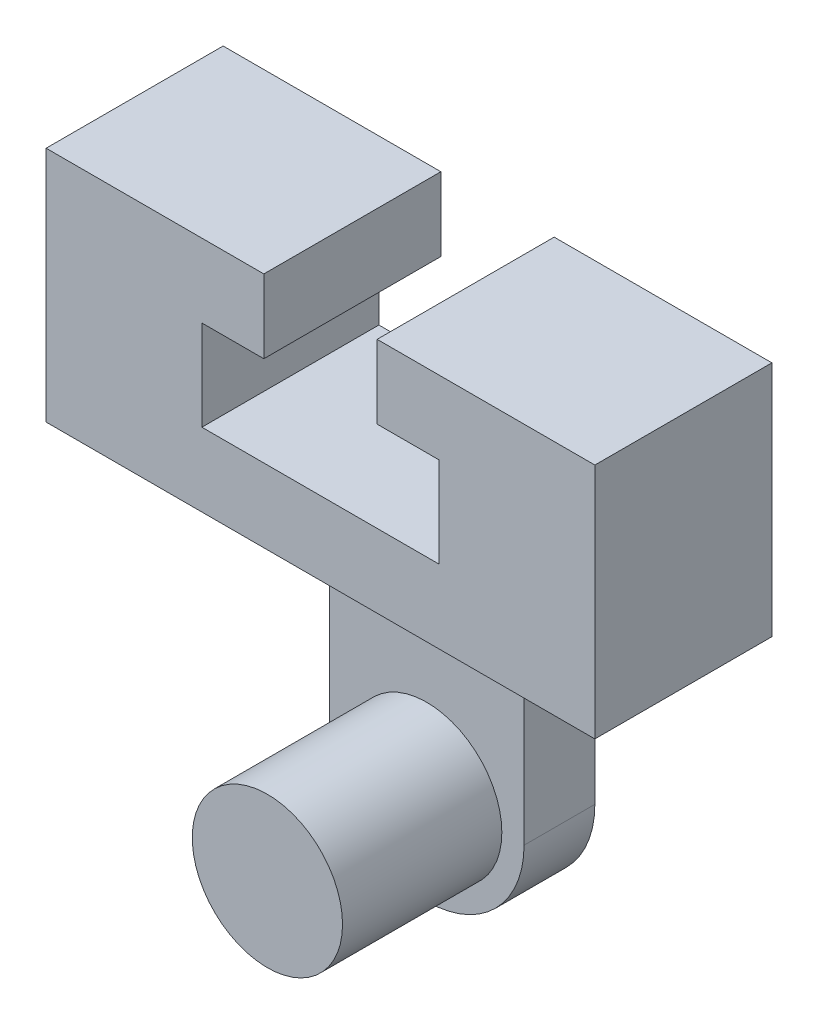
ISO-10303-21;
HEADER;
FILE_DESCRIPTION(('STEP AP214'),'2;1');
FILE_NAME('part.step','',(''),(''),'','','');
FILE_SCHEMA(('AUTOMOTIVE_DESIGN { 1 0 10303 214 1 1 1 1 }'));
ENDSEC;
DATA;
#1=APPLICATION_CONTEXT('core data for automotive mechanical design processes');
#2=APPLICATION_PROTOCOL_DEFINITION('international standard','automotive_design',2000,#1);
#3=PRODUCT_CONTEXT('',#1,'mechanical');
#4=PRODUCT('Part','Part','',(#3));
#5=PRODUCT_RELATED_PRODUCT_CATEGORY('part','',(#4));
#6=PRODUCT_DEFINITION_FORMATION('','',#4);
#7=PRODUCT_DEFINITION_CONTEXT('part definition',#1,'design');
#8=PRODUCT_DEFINITION('design','',#6,#7);
#9=PRODUCT_DEFINITION_SHAPE('','',#8);
#10=(LENGTH_UNIT() NAMED_UNIT(*) SI_UNIT(.MILLI.,.METRE.));
#11=(NAMED_UNIT(*) PLANE_ANGLE_UNIT() SI_UNIT($,.RADIAN.));
#12=(NAMED_UNIT(*) SI_UNIT($,.STERADIAN.) SOLID_ANGLE_UNIT());
#13=UNCERTAINTY_MEASURE_WITH_UNIT(LENGTH_MEASURE(1.E-05),#10,'distance_accuracy_value','');
#14=(GEOMETRIC_REPRESENTATION_CONTEXT(3) GLOBAL_UNCERTAINTY_ASSIGNED_CONTEXT((#13)) GLOBAL_UNIT_ASSIGNED_CONTEXT((#10,
#11,#12)) REPRESENTATION_CONTEXT('',''));
#15=CARTESIAN_POINT('',(0.,0.,0.));
#16=DIRECTION('',(0.,0.,1.));
#17=DIRECTION('',(1.,0.,0.));
#18=AXIS2_PLACEMENT_3D('',#15,#16,#17);
#19=CARTESIAN_POINT('',(53.34,-33.528,25.4));
#20=DIRECTION('',(-1.,0.,0.));
#21=DIRECTION('',(0.,0.,1.));
#22=AXIS2_PLACEMENT_3D('',#19,#20,#21);
#23=PLANE('',#22);
#24=DIRECTION('',(0.,1.,0.));
#25=VECTOR('',#24,1.);
#26=CARTESIAN_POINT('',(53.34,0.,10.16));
#27=LINE('',#26,#25);
#28=CARTESIAN_POINT('',(53.34,-33.528,10.16));
#29=VERTEX_POINT('',#28);
#30=CARTESIAN_POINT('',(53.34,0.,10.16));
#31=VERTEX_POINT('',#30);
#32=EDGE_CURVE('E185',#29,#31,#27,.T.);
#33=ORIENTED_EDGE('',*,*,#32,.F.);
#34=DIRECTION('',(0.,0.,-1.));
#35=VECTOR('',#34,1.);
#36=CARTESIAN_POINT('',(53.34,-33.528,25.4));
#37=LINE('',#36,#35);
#38=CARTESIAN_POINT('',(53.34,-33.528,0.));
#39=VERTEX_POINT('',#38);
#40=EDGE_CURVE('E12',#29,#39,#37,.T.);
#41=ORIENTED_EDGE('',*,*,#40,.T.);
#42=DIRECTION('',(0.,1.,0.));
#43=VECTOR('',#42,1.);
#44=CARTESIAN_POINT('',(53.34,-33.528,0.));
#45=LINE('',#44,#43);
#46=CARTESIAN_POINT('',(53.34,0.,0.));
#47=VERTEX_POINT('',#46);
#48=EDGE_CURVE('E213',#39,#47,#45,.T.);
#49=ORIENTED_EDGE('',*,*,#48,.T.);
#50=DIRECTION('',(0.,0.,-1.));
#51=VECTOR('',#50,1.);
#52=CARTESIAN_POINT('',(53.34,0.,25.4));
#53=LINE('',#52,#51);
#54=EDGE_CURVE('E56',#31,#47,#53,.T.);
#55=ORIENTED_EDGE('',*,*,#54,.F.);
#56=EDGE_LOOP('',(#33,#41,#49,#55));
#57=FACE_BOUND('',#56,.T.);
#58=ADVANCED_FACE('F51',(#57),#23,.F.);
#59=CARTESIAN_POINT('',(39.37,-33.528,25.4));
#60=DIRECTION('',(0.,0.,-1.));
#61=DIRECTION('',(-1.,0.,0.));
#62=AXIS2_PLACEMENT_3D('',#59,#60,#61);
#63=CYLINDRICAL_SURFACE('',#62,13.97);
#64=CARTESIAN_POINT('',(39.37,-33.528,10.16));
#65=DIRECTION('',(0.,0.,1.));
#66=DIRECTION('',(1.,0.,0.));
#67=AXIS2_PLACEMENT_3D('',#64,#65,#66);
#68=CIRCLE('',#67,13.97);
#69=CARTESIAN_POINT('',(25.4,-33.528,10.16));
#70=VERTEX_POINT('',#69);
#71=EDGE_CURVE('E173',#70,#29,#68,.T.);
#72=ORIENTED_EDGE('',*,*,#71,.F.);
#73=DIRECTION('',(0.,0.,-1.));
#74=VECTOR('',#73,1.);
#75=CARTESIAN_POINT('',(25.4,-33.528,25.4));
#76=LINE('',#75,#74);
#77=CARTESIAN_POINT('',(25.4,-33.528,0.));
#78=VERTEX_POINT('',#77);
#79=EDGE_CURVE('E108',#70,#78,#76,.T.);
#80=ORIENTED_EDGE('',*,*,#79,.T.);
#81=CARTESIAN_POINT('',(39.37,-33.528,0.));
#82=DIRECTION('',(0.,0.,1.));
#83=DIRECTION('',(1.,0.,0.));
#84=AXIS2_PLACEMENT_3D('',#81,#82,#83);
#85=CIRCLE('',#84,13.97);
#86=EDGE_CURVE('E217',#78,#39,#85,.T.);
#87=ORIENTED_EDGE('',*,*,#86,.T.);
#88=ORIENTED_EDGE('',*,*,#40,.F.);
#89=EDGE_LOOP('',(#72,#80,#87,#88));
#90=FACE_BOUND('',#89,.T.);
#91=ADVANCED_FACE('F52',(#90),#63,.T.);
#92=CARTESIAN_POINT('',(0.,34.036,25.4));
#93=DIRECTION('',(0.,1.,0.));
#94=DIRECTION('',(0.,0.,1.));
#95=AXIS2_PLACEMENT_3D('',#92,#93,#94);
#96=PLANE('',#95);
#97=DIRECTION('',(1.,0.,0.));
#98=VECTOR('',#97,1.);
#99=CARTESIAN_POINT('',(0.,34.036,0.));
#100=LINE('',#99,#98);
#101=CARTESIAN_POINT('',(47.498,34.036,0.));
#102=VERTEX_POINT('',#101);
#103=CARTESIAN_POINT('',(78.74,34.036,0.));
#104=VERTEX_POINT('',#103);
#105=EDGE_CURVE('E224',#102,#104,#100,.T.);
#106=ORIENTED_EDGE('',*,*,#105,.F.);
#107=DIRECTION('',(0.,0.,1.));
#108=VECTOR('',#107,1.);
#109=CARTESIAN_POINT('',(47.498,34.036,0.));
#110=LINE('',#109,#108);
#111=CARTESIAN_POINT('',(47.498,34.036,25.4));
#112=VERTEX_POINT('',#111);
#113=EDGE_CURVE('E263',#102,#112,#110,.T.);
#114=ORIENTED_EDGE('',*,*,#113,.T.);
#115=DIRECTION('',(1.,0.,0.));
#116=VECTOR('',#115,1.);
#117=CARTESIAN_POINT('',(0.,34.036,25.4));
#118=LINE('',#117,#116);
#119=CARTESIAN_POINT('',(78.74,34.036,25.4));
#120=VERTEX_POINT('',#119);
#121=EDGE_CURVE('E238',#112,#120,#118,.T.);
#122=ORIENTED_EDGE('',*,*,#121,.T.);
#123=DIRECTION('',(0.,0.,-1.));
#124=VECTOR('',#123,1.);
#125=CARTESIAN_POINT('',(78.74,34.036,25.4));
#126=LINE('',#125,#124);
#127=EDGE_CURVE('E205',#120,#104,#126,.T.);
#128=ORIENTED_EDGE('',*,*,#127,.T.);
#129=EDGE_LOOP('',(#106,#114,#122,#128));
#130=FACE_BOUND('',#129,.T.);
#131=ADVANCED_FACE('F325',(#130),#96,.T.);
#132=CARTESIAN_POINT('',(78.74,0.,25.4));
#133=DIRECTION('',(-1.,0.,0.));
#134=DIRECTION('',(0.,0.,1.));
#135=AXIS2_PLACEMENT_3D('',#132,#133,#134);
#136=PLANE('',#135);
#137=DIRECTION('',(0.,1.,0.));
#138=VECTOR('',#137,1.);
#139=CARTESIAN_POINT('',(78.74,0.,0.));
#140=LINE('',#139,#138);
#141=CARTESIAN_POINT('',(78.74,0.,0.));
#142=VERTEX_POINT('',#141);
#143=EDGE_CURVE('E223',#142,#104,#140,.T.);
#144=ORIENTED_EDGE('',*,*,#143,.T.);
#145=ORIENTED_EDGE('',*,*,#127,.F.);
#146=DIRECTION('',(0.,1.,0.));
#147=VECTOR('',#146,1.);
#148=CARTESIAN_POINT('',(78.74,0.,25.4));
#149=LINE('',#148,#147);
#150=CARTESIAN_POINT('',(78.74,0.,25.4));
#151=VERTEX_POINT('',#150);
#152=EDGE_CURVE('E236',#151,#120,#149,.T.);
#153=ORIENTED_EDGE('',*,*,#152,.F.);
#154=DIRECTION('',(0.,0.,-1.));
#155=VECTOR('',#154,1.);
#156=CARTESIAN_POINT('',(78.74,0.,25.4));
#157=LINE('',#156,#155);
#158=EDGE_CURVE('E204',#151,#142,#157,.T.);
#159=ORIENTED_EDGE('',*,*,#158,.T.);
#160=EDGE_LOOP('',(#144,#145,#153,#159));
#161=FACE_BOUND('',#160,.T.);
#162=ADVANCED_FACE('F327',(#161),#136,.F.);
#163=DIRECTION('',(0.,0.,1.));
#164=VECTOR('',#163,1.);
#165=CARTESIAN_POINT('',(31.242,34.036,0.));
#166=LINE('',#165,#164);
#167=CARTESIAN_POINT('',(31.242,34.036,0.));
#168=VERTEX_POINT('',#167);
#169=CARTESIAN_POINT('',(31.242,34.036,25.4));
#170=VERTEX_POINT('',#169);
#171=EDGE_CURVE('E262',#168,#170,#166,.T.);
#172=ORIENTED_EDGE('',*,*,#171,.F.);
#173=CARTESIAN_POINT('',(0.,34.036,0.));
#174=VERTEX_POINT('',#173);
#175=EDGE_CURVE('E230',#174,#168,#100,.T.);
#176=ORIENTED_EDGE('',*,*,#175,.F.);
#177=DIRECTION('',(0.,0.,-1.));
#178=VECTOR('',#177,1.);
#179=CARTESIAN_POINT('',(0.,34.036,25.4));
#180=LINE('',#179,#178);
#181=CARTESIAN_POINT('',(0.,34.036,25.4));
#182=VERTEX_POINT('',#181);
#183=EDGE_CURVE('E200',#182,#174,#180,.T.);
#184=ORIENTED_EDGE('',*,*,#183,.F.);
#185=EDGE_CURVE('E193',#182,#170,#118,.T.);
#186=ORIENTED_EDGE('',*,*,#185,.T.);
#187=EDGE_LOOP('',(#172,#176,#184,#186));
#188=FACE_BOUND('',#187,.T.);
#189=ADVANCED_FACE('F350',(#188),#96,.T.);
#190=CARTESIAN_POINT('',(0.,0.,25.4));
#191=DIRECTION('',(-1.,0.,0.));
#192=DIRECTION('',(0.,0.,1.));
#193=AXIS2_PLACEMENT_3D('',#190,#191,#192);
#194=PLANE('',#193);
#195=DIRECTION('',(0.,1.,0.));
#196=VECTOR('',#195,1.);
#197=CARTESIAN_POINT('',(0.,0.,0.));
#198=LINE('',#197,#196);
#199=CARTESIAN_POINT('',(0.,0.,0.));
#200=VERTEX_POINT('',#199);
#201=EDGE_CURVE('E235',#200,#174,#198,.T.);
#202=ORIENTED_EDGE('',*,*,#201,.F.);
#203=DIRECTION('',(0.,0.,-1.));
#204=VECTOR('',#203,1.);
#205=CARTESIAN_POINT('',(0.,0.,25.4));
#206=LINE('',#205,#204);
#207=CARTESIAN_POINT('',(0.,0.,25.4));
#208=VERTEX_POINT('',#207);
#209=EDGE_CURVE('E192',#208,#200,#206,.T.);
#210=ORIENTED_EDGE('',*,*,#209,.F.);
#211=DIRECTION('',(0.,1.,0.));
#212=VECTOR('',#211,1.);
#213=CARTESIAN_POINT('',(0.,0.,25.4));
#214=LINE('',#213,#212);
#215=EDGE_CURVE('E186',#208,#182,#214,.T.);
#216=ORIENTED_EDGE('',*,*,#215,.T.);
#217=ORIENTED_EDGE('',*,*,#183,.T.);
#218=EDGE_LOOP('',(#202,#210,#216,#217));
#219=FACE_BOUND('',#218,.T.);
#220=ADVANCED_FACE('F353',(#219),#194,.T.);
#221=CARTESIAN_POINT('',(0.,0.,25.4));
#222=DIRECTION('',(0.,1.,0.));
#223=DIRECTION('',(0.,0.,1.));
#224=AXIS2_PLACEMENT_3D('',#221,#222,#223);
#225=PLANE('',#224);
#226=DIRECTION('',(1.,0.,0.));
#227=VECTOR('',#226,1.);
#228=CARTESIAN_POINT('',(0.,0.,0.));
#229=LINE('',#228,#227);
#230=CARTESIAN_POINT('',(25.4,0.,0.));
#231=VERTEX_POINT('',#230);
#232=EDGE_CURVE('E234',#200,#231,#229,.T.);
#233=ORIENTED_EDGE('',*,*,#232,.T.);
#234=DIRECTION('',(0.,0.,-1.));
#235=VECTOR('',#234,1.);
#236=CARTESIAN_POINT('',(25.4,0.,25.4));
#237=LINE('',#236,#235);
#238=CARTESIAN_POINT('',(25.4,0.,10.16));
#239=VERTEX_POINT('',#238);
#240=EDGE_CURVE('E189',#239,#231,#237,.T.);
#241=ORIENTED_EDGE('',*,*,#240,.F.);
#242=DIRECTION('',(-1.,0.,0.));
#243=VECTOR('',#242,1.);
#244=CARTESIAN_POINT('',(25.4,0.,10.16));
#245=LINE('',#244,#243);
#246=EDGE_CURVE('E176',#31,#239,#245,.T.);
#247=ORIENTED_EDGE('',*,*,#246,.F.);
#248=ORIENTED_EDGE('',*,*,#54,.T.);
#249=DIRECTION('',(1.,0.,0.));
#250=VECTOR('',#249,1.);
#251=CARTESIAN_POINT('',(53.34,0.,0.));
#252=LINE('',#251,#250);
#253=EDGE_CURVE('E215',#47,#142,#252,.T.);
#254=ORIENTED_EDGE('',*,*,#253,.T.);
#255=ORIENTED_EDGE('',*,*,#158,.F.);
#256=DIRECTION('',(1.,0.,0.));
#257=VECTOR('',#256,1.);
#258=CARTESIAN_POINT('',(53.34,0.,25.4));
#259=LINE('',#258,#257);
#260=EDGE_CURVE('E74',#208,#151,#259,.T.);
#261=ORIENTED_EDGE('',*,*,#260,.F.);
#262=ORIENTED_EDGE('',*,*,#209,.T.);
#263=EDGE_LOOP('',(#233,#241,#247,#248,#254,#255,#261,#262));
#264=FACE_BOUND('',#263,.T.);
#265=ADVANCED_FACE('F208',(#264),#225,.F.);
#266=CARTESIAN_POINT('',(25.4,-33.528,25.4));
#267=DIRECTION('',(-1.,0.,0.));
#268=DIRECTION('',(0.,0.,1.));
#269=AXIS2_PLACEMENT_3D('',#266,#267,#268);
#270=PLANE('',#269);
#271=DIRECTION('',(0.,-1.,0.));
#272=VECTOR('',#271,1.);
#273=CARTESIAN_POINT('',(25.4,0.,10.16));
#274=LINE('',#273,#272);
#275=EDGE_CURVE('E171',#239,#70,#274,.T.);
#276=ORIENTED_EDGE('',*,*,#275,.F.);
#277=ORIENTED_EDGE('',*,*,#240,.T.);
#278=DIRECTION('',(0.,1.,0.));
#279=VECTOR('',#278,1.);
#280=CARTESIAN_POINT('',(25.4,-33.528,0.));
#281=LINE('',#280,#279);
#282=EDGE_CURVE('E190',#78,#231,#281,.T.);
#283=ORIENTED_EDGE('',*,*,#282,.F.);
#284=ORIENTED_EDGE('',*,*,#79,.F.);
#285=EDGE_LOOP('',(#276,#277,#283,#284));
#286=FACE_BOUND('',#285,.T.);
#287=ADVANCED_FACE('F184',(#286),#270,.T.);
#288=CARTESIAN_POINT('',(39.37,-33.528,25.4));
#289=DIRECTION('',(0.,0.,1.));
#290=DIRECTION('',(1.,0.,0.));
#291=AXIS2_PLACEMENT_3D('',#288,#289,#290);
#292=PLANE('',#291);
#293=ORIENTED_EDGE('',*,*,#215,.F.);
#294=ORIENTED_EDGE('',*,*,#260,.T.);
#295=ORIENTED_EDGE('',*,*,#152,.T.);
#296=ORIENTED_EDGE('',*,*,#121,.F.);
#297=DIRECTION('',(0.,1.,0.));
#298=VECTOR('',#297,1.);
#299=CARTESIAN_POINT('',(47.498,23.495,25.4));
#300=LINE('',#299,#298);
#301=CARTESIAN_POINT('',(47.498,23.495,25.4));
#302=VERTEX_POINT('',#301);
#303=EDGE_CURVE('E285',#302,#112,#300,.T.);
#304=ORIENTED_EDGE('',*,*,#303,.F.);
#305=DIRECTION('',(-1.,0.,0.));
#306=VECTOR('',#305,1.);
#307=CARTESIAN_POINT('',(47.498,23.495,25.4));
#308=LINE('',#307,#306);
#309=CARTESIAN_POINT('',(56.388,23.495,25.4));
#310=VERTEX_POINT('',#309);
#311=EDGE_CURVE('E284',#310,#302,#308,.T.);
#312=ORIENTED_EDGE('',*,*,#311,.F.);
#313=DIRECTION('',(0.,1.,0.));
#314=VECTOR('',#313,1.);
#315=CARTESIAN_POINT('',(56.388,10.541,25.4));
#316=LINE('',#315,#314);
#317=CARTESIAN_POINT('',(56.388,10.541,25.4));
#318=VERTEX_POINT('',#317);
#319=EDGE_CURVE('E281',#318,#310,#316,.T.);
#320=ORIENTED_EDGE('',*,*,#319,.F.);
#321=DIRECTION('',(1.,0.,0.));
#322=VECTOR('',#321,1.);
#323=CARTESIAN_POINT('',(22.352,10.541,25.4));
#324=LINE('',#323,#322);
#325=CARTESIAN_POINT('',(22.352,10.541,25.4));
#326=VERTEX_POINT('',#325);
#327=EDGE_CURVE('E257',#326,#318,#324,.T.);
#328=ORIENTED_EDGE('',*,*,#327,.F.);
#329=DIRECTION('',(0.,-1.,0.));
#330=VECTOR('',#329,1.);
#331=CARTESIAN_POINT('',(22.352,10.541,25.4));
#332=LINE('',#331,#330);
#333=CARTESIAN_POINT('',(22.352,23.495,25.4));
#334=VERTEX_POINT('',#333);
#335=EDGE_CURVE('E292',#334,#326,#332,.T.);
#336=ORIENTED_EDGE('',*,*,#335,.F.);
#337=DIRECTION('',(-1.,0.,0.));
#338=VECTOR('',#337,1.);
#339=CARTESIAN_POINT('',(22.352,23.495,25.4));
#340=LINE('',#339,#338);
#341=CARTESIAN_POINT('',(31.242,23.495,25.4));
#342=VERTEX_POINT('',#341);
#343=EDGE_CURVE('E289',#342,#334,#340,.T.);
#344=ORIENTED_EDGE('',*,*,#343,.F.);
#345=DIRECTION('',(0.,-1.,0.));
#346=VECTOR('',#345,1.);
#347=CARTESIAN_POINT('',(31.242,23.495,25.4));
#348=LINE('',#347,#346);
#349=EDGE_CURVE('E290',#170,#342,#348,.T.);
#350=ORIENTED_EDGE('',*,*,#349,.F.);
#351=ORIENTED_EDGE('',*,*,#185,.F.);
#352=EDGE_LOOP('',(#293,#294,#295,#296,#304,#312,#320,#328,#336,#344,#350,#351));
#353=FACE_BOUND('',#352,.T.);
#354=ADVANCED_FACE('F329',(#353),#292,.T.);
#355=CARTESIAN_POINT('',(39.37,-33.528,0.));
#356=DIRECTION('',(0.,0.,1.));
#357=DIRECTION('',(1.,0.,0.));
#358=AXIS2_PLACEMENT_3D('',#355,#356,#357);
#359=PLANE('',#358);
#360=DIRECTION('',(-1.,0.,0.));
#361=VECTOR('',#360,1.);
#362=CARTESIAN_POINT('',(47.498,23.495,0.));
#363=LINE('',#362,#361);
#364=CARTESIAN_POINT('',(56.388,23.495,0.));
#365=VERTEX_POINT('',#364);
#366=CARTESIAN_POINT('',(47.498,23.495,0.));
#367=VERTEX_POINT('',#366);
#368=EDGE_CURVE('E297',#365,#367,#363,.T.);
#369=ORIENTED_EDGE('',*,*,#368,.T.);
#370=DIRECTION('',(0.,1.,0.));
#371=VECTOR('',#370,1.);
#372=CARTESIAN_POINT('',(47.498,23.495,0.));
#373=LINE('',#372,#371);
#374=EDGE_CURVE('E66',#367,#102,#373,.T.);
#375=ORIENTED_EDGE('',*,*,#374,.T.);
#376=ORIENTED_EDGE('',*,*,#105,.T.);
#377=ORIENTED_EDGE('',*,*,#143,.F.);
#378=ORIENTED_EDGE('',*,*,#253,.F.);
#379=ORIENTED_EDGE('',*,*,#48,.F.);
#380=ORIENTED_EDGE('',*,*,#86,.F.);
#381=ORIENTED_EDGE('',*,*,#282,.T.);
#382=ORIENTED_EDGE('',*,*,#232,.F.);
#383=ORIENTED_EDGE('',*,*,#201,.T.);
#384=ORIENTED_EDGE('',*,*,#175,.T.);
#385=DIRECTION('',(0.,-1.,0.));
#386=VECTOR('',#385,1.);
#387=CARTESIAN_POINT('',(31.242,23.495,0.));
#388=LINE('',#387,#386);
#389=CARTESIAN_POINT('',(31.242,23.495,0.));
#390=VERTEX_POINT('',#389);
#391=EDGE_CURVE('E310',#168,#390,#388,.T.);
#392=ORIENTED_EDGE('',*,*,#391,.T.);
#393=DIRECTION('',(-1.,0.,0.));
#394=VECTOR('',#393,1.);
#395=CARTESIAN_POINT('',(22.352,23.495,0.));
#396=LINE('',#395,#394);
#397=CARTESIAN_POINT('',(22.352,23.495,0.));
#398=VERTEX_POINT('',#397);
#399=EDGE_CURVE('E280',#390,#398,#396,.T.);
#400=ORIENTED_EDGE('',*,*,#399,.T.);
#401=DIRECTION('',(0.,-1.,0.));
#402=VECTOR('',#401,1.);
#403=CARTESIAN_POINT('',(22.352,10.541,0.));
#404=LINE('',#403,#402);
#405=CARTESIAN_POINT('',(22.352,10.541,0.));
#406=VERTEX_POINT('',#405);
#407=EDGE_CURVE('E275',#398,#406,#404,.T.);
#408=ORIENTED_EDGE('',*,*,#407,.T.);
#409=DIRECTION('',(1.,0.,0.));
#410=VECTOR('',#409,1.);
#411=CARTESIAN_POINT('',(22.352,10.541,0.));
#412=LINE('',#411,#410);
#413=CARTESIAN_POINT('',(56.388,10.541,0.));
#414=VERTEX_POINT('',#413);
#415=EDGE_CURVE('E268',#406,#414,#412,.T.);
#416=ORIENTED_EDGE('',*,*,#415,.T.);
#417=DIRECTION('',(0.,1.,0.));
#418=VECTOR('',#417,1.);
#419=CARTESIAN_POINT('',(56.388,10.541,0.));
#420=LINE('',#419,#418);
#421=EDGE_CURVE('E300',#414,#365,#420,.T.);
#422=ORIENTED_EDGE('',*,*,#421,.T.);
#423=EDGE_LOOP('',(#369,#375,#376,#377,#378,#379,#380,#381,#382,#383,#384,#392,#400,#408,#416,#422));
#424=FACE_BOUND('',#423,.T.);
#425=ADVANCED_FACE('F221',(#424),#359,.F.);
#426=CARTESIAN_POINT('',(56.388,10.541,0.));
#427=DIRECTION('',(1.,0.,0.));
#428=DIRECTION('',(0.,0.,-1.));
#429=AXIS2_PLACEMENT_3D('',#426,#427,#428);
#430=PLANE('',#429);
#431=ORIENTED_EDGE('',*,*,#319,.T.);
#432=DIRECTION('',(0.,0.,1.));
#433=VECTOR('',#432,1.);
#434=CARTESIAN_POINT('',(56.388,23.495,0.));
#435=LINE('',#434,#433);
#436=EDGE_CURVE('E241',#365,#310,#435,.T.);
#437=ORIENTED_EDGE('',*,*,#436,.F.);
#438=ORIENTED_EDGE('',*,*,#421,.F.);
#439=DIRECTION('',(0.,0.,1.));
#440=VECTOR('',#439,1.);
#441=CARTESIAN_POINT('',(56.388,10.541,0.));
#442=LINE('',#441,#440);
#443=EDGE_CURVE('E246',#414,#318,#442,.T.);
#444=ORIENTED_EDGE('',*,*,#443,.T.);
#445=EDGE_LOOP('',(#431,#437,#438,#444));
#446=FACE_BOUND('',#445,.T.);
#447=ADVANCED_FACE('F320',(#446),#430,.F.);
#448=CARTESIAN_POINT('',(22.352,10.541,0.));
#449=DIRECTION('',(0.,-1.,0.));
#450=DIRECTION('',(0.,0.,-1.));
#451=AXIS2_PLACEMENT_3D('',#448,#449,#450);
#452=PLANE('',#451);
#453=ORIENTED_EDGE('',*,*,#327,.T.);
#454=ORIENTED_EDGE('',*,*,#443,.F.);
#455=ORIENTED_EDGE('',*,*,#415,.F.);
#456=DIRECTION('',(0.,0.,1.));
#457=VECTOR('',#456,1.);
#458=CARTESIAN_POINT('',(22.352,10.541,0.));
#459=LINE('',#458,#457);
#460=EDGE_CURVE('E250',#406,#326,#459,.T.);
#461=ORIENTED_EDGE('',*,*,#460,.T.);
#462=EDGE_LOOP('',(#453,#454,#455,#461));
#463=FACE_BOUND('',#462,.T.);
#464=ADVANCED_FACE('F317',(#463),#452,.F.);
#465=CARTESIAN_POINT('',(22.352,10.541,0.));
#466=DIRECTION('',(-1.,0.,0.));
#467=DIRECTION('',(0.,0.,1.));
#468=AXIS2_PLACEMENT_3D('',#465,#466,#467);
#469=PLANE('',#468);
#470=ORIENTED_EDGE('',*,*,#335,.T.);
#471=ORIENTED_EDGE('',*,*,#460,.F.);
#472=ORIENTED_EDGE('',*,*,#407,.F.);
#473=DIRECTION('',(0.,0.,1.));
#474=VECTOR('',#473,1.);
#475=CARTESIAN_POINT('',(22.352,23.495,0.));
#476=LINE('',#475,#474);
#477=EDGE_CURVE('E254',#398,#334,#476,.T.);
#478=ORIENTED_EDGE('',*,*,#477,.T.);
#479=EDGE_LOOP('',(#470,#471,#472,#478));
#480=FACE_BOUND('',#479,.T.);
#481=ADVANCED_FACE('F314',(#480),#469,.F.);
#482=CARTESIAN_POINT('',(22.352,23.495,0.));
#483=DIRECTION('',(0.,1.,0.));
#484=DIRECTION('',(-1.,0.,0.));
#485=AXIS2_PLACEMENT_3D('',#482,#483,#484);
#486=PLANE('',#485);
#487=ORIENTED_EDGE('',*,*,#343,.T.);
#488=ORIENTED_EDGE('',*,*,#477,.F.);
#489=ORIENTED_EDGE('',*,*,#399,.F.);
#490=DIRECTION('',(0.,0.,1.));
#491=VECTOR('',#490,1.);
#492=CARTESIAN_POINT('',(31.242,23.495,0.));
#493=LINE('',#492,#491);
#494=EDGE_CURVE('E258',#390,#342,#493,.T.);
#495=ORIENTED_EDGE('',*,*,#494,.T.);
#496=EDGE_LOOP('',(#487,#488,#489,#495));
#497=FACE_BOUND('',#496,.T.);
#498=ADVANCED_FACE('F312',(#497),#486,.F.);
#499=CARTESIAN_POINT('',(31.242,23.495,0.));
#500=DIRECTION('',(-1.,0.,0.));
#501=DIRECTION('',(0.,0.,1.));
#502=AXIS2_PLACEMENT_3D('',#499,#500,#501);
#503=PLANE('',#502);
#504=ORIENTED_EDGE('',*,*,#349,.T.);
#505=ORIENTED_EDGE('',*,*,#494,.F.);
#506=ORIENTED_EDGE('',*,*,#391,.F.);
#507=ORIENTED_EDGE('',*,*,#171,.T.);
#508=EDGE_LOOP('',(#504,#505,#506,#507));
#509=FACE_BOUND('',#508,.T.);
#510=ADVANCED_FACE('F335',(#509),#503,.F.);
#511=CARTESIAN_POINT('',(47.498,23.495,0.));
#512=DIRECTION('',(1.,0.,0.));
#513=DIRECTION('',(0.,0.,-1.));
#514=AXIS2_PLACEMENT_3D('',#511,#512,#513);
#515=PLANE('',#514);
#516=ORIENTED_EDGE('',*,*,#303,.T.);
#517=ORIENTED_EDGE('',*,*,#113,.F.);
#518=ORIENTED_EDGE('',*,*,#374,.F.);
#519=DIRECTION('',(0.,0.,1.));
#520=VECTOR('',#519,1.);
#521=CARTESIAN_POINT('',(47.498,23.495,0.));
#522=LINE('',#521,#520);
#523=EDGE_CURVE('E266',#367,#302,#522,.T.);
#524=ORIENTED_EDGE('',*,*,#523,.T.);
#525=EDGE_LOOP('',(#516,#517,#518,#524));
#526=FACE_BOUND('',#525,.T.);
#527=ADVANCED_FACE('F330',(#526),#515,.F.);
#528=CARTESIAN_POINT('',(47.498,23.495,0.));
#529=DIRECTION('',(0.,1.,0.));
#530=DIRECTION('',(-1.,0.,0.));
#531=AXIS2_PLACEMENT_3D('',#528,#529,#530);
#532=PLANE('',#531);
#533=ORIENTED_EDGE('',*,*,#311,.T.);
#534=ORIENTED_EDGE('',*,*,#523,.F.);
#535=ORIENTED_EDGE('',*,*,#368,.F.);
#536=ORIENTED_EDGE('',*,*,#436,.T.);
#537=EDGE_LOOP('',(#533,#534,#535,#536));
#538=FACE_BOUND('',#537,.T.);
#539=ADVANCED_FACE('F316',(#538),#532,.F.);
#540=CARTESIAN_POINT('',(39.37,-33.528,10.16));
#541=DIRECTION('',(0.,0.,1.));
#542=DIRECTION('',(1.,0.,0.));
#543=AXIS2_PLACEMENT_3D('',#540,#541,#542);
#544=PLANE('',#543);
#545=CARTESIAN_POINT('',(39.37,-33.528,10.16));
#546=DIRECTION('',(0.,0.,1.));
#547=DIRECTION('',(1.,0.,0.));
#548=AXIS2_PLACEMENT_3D('',#545,#546,#547);
#549=CIRCLE('',#548,10.7823);
#550=CARTESIAN_POINT('',(50.1523,-33.528,10.16));
#551=VERTEX_POINT('',#550);
#552=EDGE_CURVE('E520',#551,#551,#549,.T.);
#553=ORIENTED_EDGE('',*,*,#552,.F.);
#554=EDGE_LOOP('',(#553));
#555=FACE_BOUND('',#554,.T.);
#556=ORIENTED_EDGE('',*,*,#275,.T.);
#557=ORIENTED_EDGE('',*,*,#71,.T.);
#558=ORIENTED_EDGE('',*,*,#32,.T.);
#559=ORIENTED_EDGE('',*,*,#246,.T.);
#560=EDGE_LOOP('',(#556,#557,#558,#559));
#561=FACE_BOUND('',#560,.T.);
#562=ADVANCED_FACE('F175',(#555,#561),#544,.T.);
#563=CARTESIAN_POINT('',(39.37,-33.528,33.02));
#564=DIRECTION('',(0.,0.,-1.));
#565=DIRECTION('',(-1.,0.,0.));
#566=AXIS2_PLACEMENT_3D('',#563,#564,#565);
#567=CYLINDRICAL_SURFACE('',#566,10.7823);
#568=CARTESIAN_POINT('',(39.37,-33.528,33.02));
#569=DIRECTION('',(0.,0.,1.));
#570=DIRECTION('',(1.,0.,0.));
#571=AXIS2_PLACEMENT_3D('',#568,#569,#570);
#572=CIRCLE('',#571,10.7823);
#573=CARTESIAN_POINT('',(50.1523,-33.528,33.02));
#574=VERTEX_POINT('',#573);
#575=EDGE_CURVE('E177',#574,#574,#572,.T.);
#576=ORIENTED_EDGE('',*,*,#575,.F.);
#577=EDGE_LOOP('',(#576));
#578=FACE_BOUND('',#577,.T.);
#579=ORIENTED_EDGE('',*,*,#552,.T.);
#580=EDGE_LOOP('',(#579));
#581=FACE_BOUND('',#580,.T.);
#582=ADVANCED_FACE('F408',(#578,#581),#567,.T.);
#583=CARTESIAN_POINT('',(39.37,-33.528,33.02));
#584=DIRECTION('',(0.,0.,1.));
#585=DIRECTION('',(1.,0.,0.));
#586=AXIS2_PLACEMENT_3D('',#583,#584,#585);
#587=PLANE('',#586);
#588=ORIENTED_EDGE('',*,*,#575,.T.);
#589=EDGE_LOOP('',(#588));
#590=FACE_BOUND('',#589,.T.);
#591=ADVANCED_FACE('F410',(#590),#587,.T.);
#592=CLOSED_SHELL('',(#58,#91,#131,#162,#189,#220,#265,#287,#354,#425,#447,#464,#481,#498,#510,
#527,#539,#562,#582,#591));
#593=MANIFOLD_SOLID_BREP('B2',#592);
#594=ADVANCED_BREP_SHAPE_REPRESENTATION('',(#18,#593),#14);
#595=SHAPE_DEFINITION_REPRESENTATION(#9,#594);
ENDSEC;
END-ISO-10303-21;
